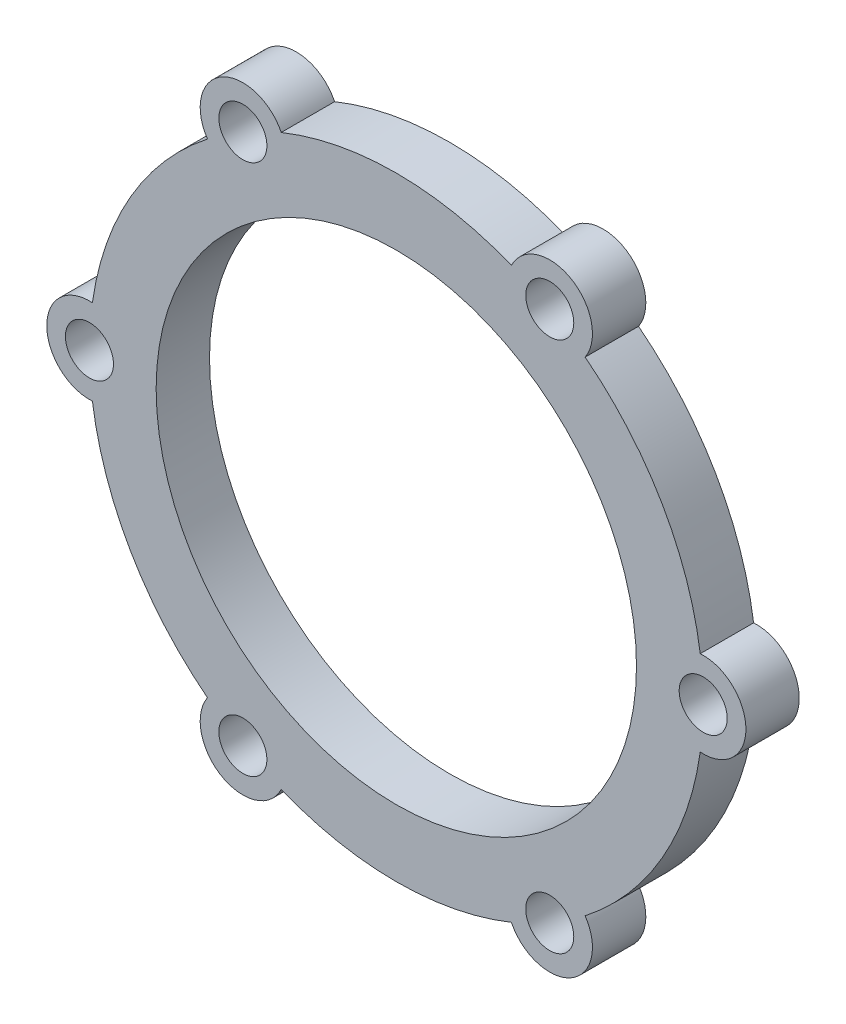
ISO-10303-21;
HEADER;
FILE_DESCRIPTION(('STEP AP214'),'2;1');
FILE_NAME('part.step','',(''),(''),'','','');
FILE_SCHEMA(('AUTOMOTIVE_DESIGN { 1 0 10303 214 1 1 1 1 }'));
ENDSEC;
DATA;
#1=APPLICATION_CONTEXT('core data for automotive mechanical design processes');
#2=APPLICATION_PROTOCOL_DEFINITION('international standard','automotive_design',2000,#1);
#3=PRODUCT_CONTEXT('',#1,'mechanical');
#4=PRODUCT('Part','Part','',(#3));
#5=PRODUCT_RELATED_PRODUCT_CATEGORY('part','',(#4));
#6=PRODUCT_DEFINITION_FORMATION('','',#4);
#7=PRODUCT_DEFINITION_CONTEXT('part definition',#1,'design');
#8=PRODUCT_DEFINITION('design','',#6,#7);
#9=PRODUCT_DEFINITION_SHAPE('','',#8);
#10=(LENGTH_UNIT() NAMED_UNIT(*) SI_UNIT(.MILLI.,.METRE.));
#11=(NAMED_UNIT(*) PLANE_ANGLE_UNIT() SI_UNIT($,.RADIAN.));
#12=(NAMED_UNIT(*) SI_UNIT($,.STERADIAN.) SOLID_ANGLE_UNIT());
#13=UNCERTAINTY_MEASURE_WITH_UNIT(LENGTH_MEASURE(1.E-05),#10,'distance_accuracy_value','');
#14=(GEOMETRIC_REPRESENTATION_CONTEXT(3) GLOBAL_UNCERTAINTY_ASSIGNED_CONTEXT((#13)) GLOBAL_UNIT_ASSIGNED_CONTEXT((#10,
#11,#12)) REPRESENTATION_CONTEXT('',''));
#15=CARTESIAN_POINT('',(0.,0.,0.));
#16=DIRECTION('',(0.,0.,1.));
#17=DIRECTION('',(1.,0.,0.));
#18=AXIS2_PLACEMENT_3D('',#15,#16,#17);
#19=CARTESIAN_POINT('',(-28.7499999999996,49.7964607176055,10.));
#20=DIRECTION('',(0.,0.,-1.));
#21=DIRECTION('',(-1.,0.,0.));
#22=AXIS2_PLACEMENT_3D('',#19,#20,#21);
#23=CYLINDRICAL_SURFACE('',#22,8.);
#24=CARTESIAN_POINT('',(-28.7499999999996,49.7964607176055,0.));
#25=DIRECTION('',(0.,0.,1.));
#26=DIRECTION('',(1.,0.,0.));
#27=AXIS2_PLACEMENT_3D('',#24,#25,#26);
#28=CIRCLE('',#27,8.);
#29=CARTESIAN_POINT('',(-21.5603201252367,53.3048083768933,0.));
#30=VERTEX_POINT('',#29);
#31=CARTESIAN_POINT('',(-35.383158135632,45.3241891306272,0.));
#32=VERTEX_POINT('',#31);
#33=EDGE_CURVE('E186',#30,#32,#28,.T.);
#34=ORIENTED_EDGE('',*,*,#33,.T.);
#35=DIRECTION('',(0.,0.,-1.));
#36=VECTOR('',#35,1.);
#37=CARTESIAN_POINT('',(-35.383158135632,45.3241891306272,10.));
#38=LINE('',#37,#36);
#39=CARTESIAN_POINT('',(-35.383158135632,45.3241891306272,10.));
#40=VERTEX_POINT('',#39);
#41=EDGE_CURVE('E11',#40,#32,#38,.T.);
#42=ORIENTED_EDGE('',*,*,#41,.F.);
#43=CARTESIAN_POINT('',(-28.7499999999996,49.7964607176055,10.));
#44=DIRECTION('',(0.,0.,1.));
#45=DIRECTION('',(1.,0.,0.));
#46=AXIS2_PLACEMENT_3D('',#43,#44,#45);
#47=CIRCLE('',#46,8.);
#48=CARTESIAN_POINT('',(-21.5603201252367,53.3048083768933,10.));
#49=VERTEX_POINT('',#48);
#50=EDGE_CURVE('E222',#49,#40,#47,.T.);
#51=ORIENTED_EDGE('',*,*,#50,.F.);
#52=DIRECTION('',(0.,0.,-1.));
#53=VECTOR('',#52,1.);
#54=CARTESIAN_POINT('',(-21.5603201252367,53.3048083768933,10.));
#55=LINE('',#54,#53);
#56=EDGE_CURVE('E184',#49,#30,#55,.T.);
#57=ORIENTED_EDGE('',*,*,#56,.T.);
#58=EDGE_LOOP('',(#34,#42,#51,#57));
#59=FACE_BOUND('',#58,.T.);
#60=ADVANCED_FACE('F43',(#59),#23,.T.);
#61=CARTESIAN_POINT('',(0.,0.,10.));
#62=DIRECTION('',(0.,0.,-1.));
#63=DIRECTION('',(-1.,0.,0.));
#64=AXIS2_PLACEMENT_3D('',#61,#62,#63);
#65=CYLINDRICAL_SURFACE('',#64,57.5);
#66=CARTESIAN_POINT('',(0.,0.,0.));
#67=DIRECTION('',(0.,0.,1.));
#68=DIRECTION('',(1.,0.,0.));
#69=AXIS2_PLACEMENT_3D('',#66,#67,#68);
#70=CIRCLE('',#69,57.5);
#71=CARTESIAN_POINT('',(-56.9434782608695,7.98061924626663,0.));
#72=VERTEX_POINT('',#71);
#73=EDGE_CURVE('E188',#32,#72,#70,.T.);
#74=ORIENTED_EDGE('',*,*,#73,.T.);
#75=DIRECTION('',(0.,0.,-1.));
#76=VECTOR('',#75,1.);
#77=CARTESIAN_POINT('',(-56.9434782608695,7.98061924626663,10.));
#78=LINE('',#77,#76);
#79=CARTESIAN_POINT('',(-56.9434782608695,7.98061924626663,10.));
#80=VERTEX_POINT('',#79);
#81=EDGE_CURVE('E51',#80,#72,#78,.T.);
#82=ORIENTED_EDGE('',*,*,#81,.F.);
#83=CARTESIAN_POINT('',(0.,0.,10.));
#84=DIRECTION('',(0.,0.,1.));
#85=DIRECTION('',(1.,0.,0.));
#86=AXIS2_PLACEMENT_3D('',#83,#84,#85);
#87=CIRCLE('',#86,57.5);
#88=EDGE_CURVE('E114',#40,#80,#87,.T.);
#89=ORIENTED_EDGE('',*,*,#88,.F.);
#90=ORIENTED_EDGE('',*,*,#41,.T.);
#91=EDGE_LOOP('',(#74,#82,#89,#90));
#92=FACE_BOUND('',#91,.T.);
#93=ADVANCED_FACE('F282',(#92),#65,.T.);
#94=CARTESIAN_POINT('',(-57.5,3.92047505570758E-13,10.));
#95=DIRECTION('',(0.,0.,-1.));
#96=DIRECTION('',(-1.,0.,0.));
#97=AXIS2_PLACEMENT_3D('',#94,#95,#96);
#98=CYLINDRICAL_SURFACE('',#97,8.);
#99=CARTESIAN_POINT('',(-57.5,3.92047505570758E-13,0.));
#100=DIRECTION('',(0.,0.,1.));
#101=DIRECTION('',(1.,0.,0.));
#102=AXIS2_PLACEMENT_3D('',#99,#100,#101);
#103=CIRCLE('',#102,8.);
#104=CARTESIAN_POINT('',(-56.9434782608696,-7.98061924626585,0.));
#105=VERTEX_POINT('',#104);
#106=EDGE_CURVE('E192',#72,#105,#103,.T.);
#107=ORIENTED_EDGE('',*,*,#106,.T.);
#108=DIRECTION('',(0.,0.,-1.));
#109=VECTOR('',#108,1.);
#110=CARTESIAN_POINT('',(-56.9434782608696,-7.98061924626585,10.));
#111=LINE('',#110,#109);
#112=CARTESIAN_POINT('',(-56.9434782608696,-7.98061924626585,10.));
#113=VERTEX_POINT('',#112);
#114=EDGE_CURVE('E243',#113,#105,#111,.T.);
#115=ORIENTED_EDGE('',*,*,#114,.F.);
#116=CARTESIAN_POINT('',(-57.5,3.92047505570758E-13,10.));
#117=DIRECTION('',(0.,0.,1.));
#118=DIRECTION('',(1.,0.,0.));
#119=AXIS2_PLACEMENT_3D('',#116,#117,#118);
#120=CIRCLE('',#119,8.);
#121=EDGE_CURVE('E252',#80,#113,#120,.T.);
#122=ORIENTED_EDGE('',*,*,#121,.F.);
#123=ORIENTED_EDGE('',*,*,#81,.T.);
#124=EDGE_LOOP('',(#107,#115,#122,#123));
#125=FACE_BOUND('',#124,.T.);
#126=ADVANCED_FACE('F249',(#125),#98,.T.);
#127=CARTESIAN_POINT('',(-35.3831581356326,-45.3241891306267,0.));
#128=VERTEX_POINT('',#127);
#129=EDGE_CURVE('E195',#105,#128,#70,.T.);
#130=ORIENTED_EDGE('',*,*,#129,.T.);
#131=DIRECTION('',(0.,0.,-1.));
#132=VECTOR('',#131,1.);
#133=CARTESIAN_POINT('',(-35.3831581356326,-45.3241891306267,10.));
#134=LINE('',#133,#132);
#135=CARTESIAN_POINT('',(-35.3831581356326,-45.3241891306267,10.));
#136=VERTEX_POINT('',#135);
#137=EDGE_CURVE('E238',#136,#128,#134,.T.);
#138=ORIENTED_EDGE('',*,*,#137,.F.);
#139=EDGE_CURVE('E570',#113,#136,#87,.T.);
#140=ORIENTED_EDGE('',*,*,#139,.F.);
#141=ORIENTED_EDGE('',*,*,#114,.T.);
#142=EDGE_LOOP('',(#130,#138,#140,#141));
#143=FACE_BOUND('',#142,.T.);
#144=ADVANCED_FACE('F291',(#143),#65,.T.);
#145=CARTESIAN_POINT('',(-28.7500000000002,-49.7964607176051,10.));
#146=DIRECTION('',(0.,0.,-1.));
#147=DIRECTION('',(-1.,0.,0.));
#148=AXIS2_PLACEMENT_3D('',#145,#146,#147);
#149=CYLINDRICAL_SURFACE('',#148,7.99999999999999);
#150=CARTESIAN_POINT('',(-28.7500000000002,-49.7964607176051,0.));
#151=DIRECTION('',(0.,0.,1.));
#152=DIRECTION('',(1.,0.,0.));
#153=AXIS2_PLACEMENT_3D('',#150,#151,#152);
#154=CIRCLE('',#153,7.99999999999999);
#155=CARTESIAN_POINT('',(-21.5603201252374,-53.304808376893,0.));
#156=VERTEX_POINT('',#155);
#157=EDGE_CURVE('E191',#128,#156,#154,.T.);
#158=ORIENTED_EDGE('',*,*,#157,.T.);
#159=DIRECTION('',(0.,0.,-1.));
#160=VECTOR('',#159,1.);
#161=CARTESIAN_POINT('',(-21.5603201252374,-53.304808376893,10.));
#162=LINE('',#161,#160);
#163=CARTESIAN_POINT('',(-21.5603201252374,-53.304808376893,10.));
#164=VERTEX_POINT('',#163);
#165=EDGE_CURVE('E240',#164,#156,#162,.T.);
#166=ORIENTED_EDGE('',*,*,#165,.F.);
#167=CARTESIAN_POINT('',(-28.7500000000002,-49.7964607176051,10.));
#168=DIRECTION('',(0.,0.,1.));
#169=DIRECTION('',(1.,0.,0.));
#170=AXIS2_PLACEMENT_3D('',#167,#168,#169);
#171=CIRCLE('',#170,7.99999999999999);
#172=EDGE_CURVE('E567',#136,#164,#171,.T.);
#173=ORIENTED_EDGE('',*,*,#172,.F.);
#174=ORIENTED_EDGE('',*,*,#137,.T.);
#175=EDGE_LOOP('',(#158,#166,#173,#174));
#176=FACE_BOUND('',#175,.T.);
#177=ADVANCED_FACE('F316',(#176),#149,.T.);
#178=CARTESIAN_POINT('',(21.5603201252371,-53.3048083768931,0.));
#179=VERTEX_POINT('',#178);
#180=EDGE_CURVE('E197',#156,#179,#70,.T.);
#181=ORIENTED_EDGE('',*,*,#180,.T.);
#182=DIRECTION('',(0.,0.,-1.));
#183=VECTOR('',#182,1.);
#184=CARTESIAN_POINT('',(21.5603201252371,-53.3048083768931,10.));
#185=LINE('',#184,#183);
#186=CARTESIAN_POINT('',(21.5603201252371,-53.3048083768931,10.));
#187=VERTEX_POINT('',#186);
#188=EDGE_CURVE('E233',#187,#179,#185,.T.);
#189=ORIENTED_EDGE('',*,*,#188,.F.);
#190=EDGE_CURVE('E564',#164,#187,#87,.T.);
#191=ORIENTED_EDGE('',*,*,#190,.F.);
#192=ORIENTED_EDGE('',*,*,#165,.T.);
#193=EDGE_LOOP('',(#181,#189,#191,#192));
#194=FACE_BOUND('',#193,.T.);
#195=ADVANCED_FACE('F320',(#194),#65,.T.);
#196=CARTESIAN_POINT('',(28.7499999999999,-49.7964607176053,10.));
#197=DIRECTION('',(0.,0.,-1.));
#198=DIRECTION('',(-1.,0.,0.));
#199=AXIS2_PLACEMENT_3D('',#196,#197,#198);
#200=CYLINDRICAL_SURFACE('',#199,8.);
#201=CARTESIAN_POINT('',(28.7499999999999,-49.7964607176053,0.));
#202=DIRECTION('',(0.,0.,1.));
#203=DIRECTION('',(1.,0.,0.));
#204=AXIS2_PLACEMENT_3D('',#201,#202,#203);
#205=CIRCLE('',#204,8.);
#206=CARTESIAN_POINT('',(35.3831581356323,-45.3241891306269,0.));
#207=VERTEX_POINT('',#206);
#208=EDGE_CURVE('E200',#179,#207,#205,.T.);
#209=ORIENTED_EDGE('',*,*,#208,.T.);
#210=DIRECTION('',(0.,0.,-1.));
#211=VECTOR('',#210,1.);
#212=CARTESIAN_POINT('',(35.3831581356323,-45.3241891306269,10.));
#213=LINE('',#212,#211);
#214=CARTESIAN_POINT('',(35.3831581356323,-45.3241891306269,10.));
#215=VERTEX_POINT('',#214);
#216=EDGE_CURVE('E231',#215,#207,#213,.T.);
#217=ORIENTED_EDGE('',*,*,#216,.F.);
#218=CARTESIAN_POINT('',(28.7499999999999,-49.7964607176053,10.));
#219=DIRECTION('',(0.,0.,1.));
#220=DIRECTION('',(1.,0.,0.));
#221=AXIS2_PLACEMENT_3D('',#218,#219,#220);
#222=CIRCLE('',#221,8.);
#223=EDGE_CURVE('E565',#187,#215,#222,.T.);
#224=ORIENTED_EDGE('',*,*,#223,.F.);
#225=ORIENTED_EDGE('',*,*,#188,.T.);
#226=EDGE_LOOP('',(#209,#217,#224,#225));
#227=FACE_BOUND('',#226,.T.);
#228=ADVANCED_FACE('F335',(#227),#200,.T.);
#229=CARTESIAN_POINT('',(56.9434782608696,-7.98061924626622,0.));
#230=VERTEX_POINT('',#229);
#231=EDGE_CURVE('E199',#207,#230,#70,.T.);
#232=ORIENTED_EDGE('',*,*,#231,.T.);
#233=DIRECTION('',(0.,0.,-1.));
#234=VECTOR('',#233,1.);
#235=CARTESIAN_POINT('',(56.9434782608696,-7.98061924626622,10.));
#236=LINE('',#235,#234);
#237=CARTESIAN_POINT('',(56.9434782608696,-7.98061924626622,10.));
#238=VERTEX_POINT('',#237);
#239=EDGE_CURVE('E228',#238,#230,#236,.T.);
#240=ORIENTED_EDGE('',*,*,#239,.F.);
#241=EDGE_CURVE('E152',#215,#238,#87,.T.);
#242=ORIENTED_EDGE('',*,*,#241,.F.);
#243=ORIENTED_EDGE('',*,*,#216,.T.);
#244=EDGE_LOOP('',(#232,#240,#242,#243));
#245=FACE_BOUND('',#244,.T.);
#246=ADVANCED_FACE('F266',(#245),#65,.T.);
#247=CARTESIAN_POINT('',(57.5,0.,10.));
#248=DIRECTION('',(0.,0.,-1.));
#249=DIRECTION('',(-1.,0.,0.));
#250=AXIS2_PLACEMENT_3D('',#247,#248,#249);
#251=CYLINDRICAL_SURFACE('',#250,8.);
#252=CARTESIAN_POINT('',(57.5,0.,0.));
#253=DIRECTION('',(0.,0.,1.));
#254=DIRECTION('',(1.,0.,0.));
#255=AXIS2_PLACEMENT_3D('',#252,#253,#254);
#256=CIRCLE('',#255,8.);
#257=CARTESIAN_POINT('',(56.9434782608696,7.98061924626627,0.));
#258=VERTEX_POINT('',#257);
#259=EDGE_CURVE('E196',#230,#258,#256,.T.);
#260=ORIENTED_EDGE('',*,*,#259,.T.);
#261=DIRECTION('',(0.,0.,-1.));
#262=VECTOR('',#261,1.);
#263=CARTESIAN_POINT('',(56.9434782608696,7.98061924626627,10.));
#264=LINE('',#263,#262);
#265=CARTESIAN_POINT('',(56.9434782608696,7.98061924626627,10.));
#266=VERTEX_POINT('',#265);
#267=EDGE_CURVE('E157',#266,#258,#264,.T.);
#268=ORIENTED_EDGE('',*,*,#267,.F.);
#269=CARTESIAN_POINT('',(57.5,0.,10.));
#270=DIRECTION('',(0.,0.,1.));
#271=DIRECTION('',(1.,0.,0.));
#272=AXIS2_PLACEMENT_3D('',#269,#270,#271);
#273=CIRCLE('',#272,8.);
#274=EDGE_CURVE('E147',#238,#266,#273,.T.);
#275=ORIENTED_EDGE('',*,*,#274,.F.);
#276=ORIENTED_EDGE('',*,*,#239,.T.);
#277=EDGE_LOOP('',(#260,#268,#275,#276));
#278=FACE_BOUND('',#277,.T.);
#279=ADVANCED_FACE('F275',(#278),#251,.T.);
#280=CARTESIAN_POINT('',(35.3831581356323,45.3241891306269,0.));
#281=VERTEX_POINT('',#280);
#282=EDGE_CURVE('E151',#258,#281,#70,.T.);
#283=ORIENTED_EDGE('',*,*,#282,.T.);
#284=DIRECTION('',(0.,0.,-1.));
#285=VECTOR('',#284,1.);
#286=CARTESIAN_POINT('',(35.3831581356323,45.3241891306269,10.));
#287=LINE('',#286,#285);
#288=CARTESIAN_POINT('',(35.3831581356323,45.3241891306269,10.));
#289=VERTEX_POINT('',#288);
#290=EDGE_CURVE('E155',#289,#281,#287,.T.);
#291=ORIENTED_EDGE('',*,*,#290,.F.);
#292=EDGE_CURVE('E137',#266,#289,#87,.T.);
#293=ORIENTED_EDGE('',*,*,#292,.F.);
#294=ORIENTED_EDGE('',*,*,#267,.T.);
#295=EDGE_LOOP('',(#283,#291,#293,#294));
#296=FACE_BOUND('',#295,.T.);
#297=ADVANCED_FACE('F153',(#296),#65,.T.);
#298=CARTESIAN_POINT('',(28.7499999999999,49.7964607176053,10.));
#299=DIRECTION('',(0.,0.,-1.));
#300=DIRECTION('',(-1.,0.,0.));
#301=AXIS2_PLACEMENT_3D('',#298,#299,#300);
#302=CYLINDRICAL_SURFACE('',#301,8.);
#303=CARTESIAN_POINT('',(28.7499999999999,49.7964607176053,0.));
#304=DIRECTION('',(0.,0.,1.));
#305=DIRECTION('',(1.,0.,0.));
#306=AXIS2_PLACEMENT_3D('',#303,#304,#305);
#307=CIRCLE('',#306,8.);
#308=CARTESIAN_POINT('',(21.5603201252371,53.3048083768931,0.));
#309=VERTEX_POINT('',#308);
#310=EDGE_CURVE('E99',#281,#309,#307,.T.);
#311=ORIENTED_EDGE('',*,*,#310,.T.);
#312=DIRECTION('',(0.,0.,-1.));
#313=VECTOR('',#312,1.);
#314=CARTESIAN_POINT('',(21.5603201252371,53.3048083768931,10.));
#315=LINE('',#314,#313);
#316=CARTESIAN_POINT('',(21.5603201252371,53.3048083768931,10.));
#317=VERTEX_POINT('',#316);
#318=EDGE_CURVE('E160',#317,#309,#315,.T.);
#319=ORIENTED_EDGE('',*,*,#318,.F.);
#320=CARTESIAN_POINT('',(28.7499999999999,49.7964607176053,10.));
#321=DIRECTION('',(0.,0.,1.));
#322=DIRECTION('',(1.,0.,0.));
#323=AXIS2_PLACEMENT_3D('',#320,#321,#322);
#324=CIRCLE('',#323,8.);
#325=EDGE_CURVE('E143',#289,#317,#324,.T.);
#326=ORIENTED_EDGE('',*,*,#325,.F.);
#327=ORIENTED_EDGE('',*,*,#290,.T.);
#328=EDGE_LOOP('',(#311,#319,#326,#327));
#329=FACE_BOUND('',#328,.T.);
#330=ADVANCED_FACE('F159',(#329),#302,.T.);
#331=CARTESIAN_POINT('',(28.7499999999999,49.7964607176053,10.));
#332=DIRECTION('',(0.,0.,-1.));
#333=DIRECTION('',(-1.,0.,0.));
#334=AXIS2_PLACEMENT_3D('',#331,#332,#333);
#335=CYLINDRICAL_SURFACE('',#334,4.5);
#336=CARTESIAN_POINT('',(28.7499999999999,49.7964607176053,10.));
#337=DIRECTION('',(0.,0.,1.));
#338=DIRECTION('',(1.,0.,0.));
#339=AXIS2_PLACEMENT_3D('',#336,#337,#338);
#340=CIRCLE('',#339,4.5);
#341=CARTESIAN_POINT('',(33.2499999999999,49.7964607176053,10.));
#342=VERTEX_POINT('',#341);
#343=EDGE_CURVE('E177',#342,#342,#340,.T.);
#344=ORIENTED_EDGE('',*,*,#343,.T.);
#345=EDGE_LOOP('',(#344));
#346=FACE_BOUND('',#345,.T.);
#347=CARTESIAN_POINT('',(28.7499999999999,49.7964607176053,0.));
#348=DIRECTION('',(0.,0.,1.));
#349=DIRECTION('',(1.,0.,0.));
#350=AXIS2_PLACEMENT_3D('',#347,#348,#349);
#351=CIRCLE('',#350,4.5);
#352=CARTESIAN_POINT('',(33.2499999999999,49.7964607176053,0.));
#353=VERTEX_POINT('',#352);
#354=EDGE_CURVE('E216',#353,#353,#351,.T.);
#355=ORIENTED_EDGE('',*,*,#354,.F.);
#356=EDGE_LOOP('',(#355));
#357=FACE_BOUND('',#356,.T.);
#358=ADVANCED_FACE('F364',(#346,#357),#335,.F.);
#359=CARTESIAN_POINT('',(57.5,0.,10.));
#360=DIRECTION('',(0.,0.,-1.));
#361=DIRECTION('',(-1.,0.,0.));
#362=AXIS2_PLACEMENT_3D('',#359,#360,#361);
#363=CYLINDRICAL_SURFACE('',#362,4.49999999999999);
#364=CARTESIAN_POINT('',(57.5,0.,10.));
#365=DIRECTION('',(0.,0.,1.));
#366=DIRECTION('',(1.,0.,0.));
#367=AXIS2_PLACEMENT_3D('',#364,#365,#366);
#368=CIRCLE('',#367,4.49999999999999);
#369=CARTESIAN_POINT('',(62.,0.,10.));
#370=VERTEX_POINT('',#369);
#371=EDGE_CURVE('E176',#370,#370,#368,.T.);
#372=ORIENTED_EDGE('',*,*,#371,.T.);
#373=EDGE_LOOP('',(#372));
#374=FACE_BOUND('',#373,.T.);
#375=CARTESIAN_POINT('',(57.5,0.,0.));
#376=DIRECTION('',(0.,0.,1.));
#377=DIRECTION('',(1.,0.,0.));
#378=AXIS2_PLACEMENT_3D('',#375,#376,#377);
#379=CIRCLE('',#378,4.49999999999999);
#380=CARTESIAN_POINT('',(62.,0.,0.));
#381=VERTEX_POINT('',#380);
#382=EDGE_CURVE('E214',#381,#381,#379,.T.);
#383=ORIENTED_EDGE('',*,*,#382,.F.);
#384=EDGE_LOOP('',(#383));
#385=FACE_BOUND('',#384,.T.);
#386=ADVANCED_FACE('F375',(#374,#385),#363,.F.);
#387=CARTESIAN_POINT('',(28.7499999999999,-49.7964607176053,10.));
#388=DIRECTION('',(0.,0.,-1.));
#389=DIRECTION('',(-1.,0.,0.));
#390=AXIS2_PLACEMENT_3D('',#387,#388,#389);
#391=CYLINDRICAL_SURFACE('',#390,4.5);
#392=CARTESIAN_POINT('',(28.7499999999999,-49.7964607176053,10.));
#393=DIRECTION('',(0.,0.,1.));
#394=DIRECTION('',(1.,0.,0.));
#395=AXIS2_PLACEMENT_3D('',#392,#393,#394);
#396=CIRCLE('',#395,4.5);
#397=CARTESIAN_POINT('',(33.2499999999999,-49.7964607176053,10.));
#398=VERTEX_POINT('',#397);
#399=EDGE_CURVE('E171',#398,#398,#396,.T.);
#400=ORIENTED_EDGE('',*,*,#399,.T.);
#401=EDGE_LOOP('',(#400));
#402=FACE_BOUND('',#401,.T.);
#403=CARTESIAN_POINT('',(28.7499999999999,-49.7964607176053,0.));
#404=DIRECTION('',(0.,0.,1.));
#405=DIRECTION('',(1.,0.,0.));
#406=AXIS2_PLACEMENT_3D('',#403,#404,#405);
#407=CIRCLE('',#406,4.5);
#408=CARTESIAN_POINT('',(33.2499999999999,-49.7964607176053,0.));
#409=VERTEX_POINT('',#408);
#410=EDGE_CURVE('E212',#409,#409,#407,.T.);
#411=ORIENTED_EDGE('',*,*,#410,.F.);
#412=EDGE_LOOP('',(#411));
#413=FACE_BOUND('',#412,.T.);
#414=ADVANCED_FACE('F382',(#402,#413),#391,.F.);
#415=CARTESIAN_POINT('',(-28.7500000000002,-49.7964607176051,10.));
#416=DIRECTION('',(0.,0.,-1.));
#417=DIRECTION('',(-1.,0.,0.));
#418=AXIS2_PLACEMENT_3D('',#415,#416,#417);
#419=CYLINDRICAL_SURFACE('',#418,4.5);
#420=CARTESIAN_POINT('',(-28.7500000000002,-49.7964607176051,10.));
#421=DIRECTION('',(0.,0.,1.));
#422=DIRECTION('',(1.,0.,0.));
#423=AXIS2_PLACEMENT_3D('',#420,#421,#422);
#424=CIRCLE('',#423,4.5);
#425=CARTESIAN_POINT('',(-24.2500000000002,-49.7964607176051,10.));
#426=VERTEX_POINT('',#425);
#427=EDGE_CURVE('E169',#426,#426,#424,.T.);
#428=ORIENTED_EDGE('',*,*,#427,.T.);
#429=EDGE_LOOP('',(#428));
#430=FACE_BOUND('',#429,.T.);
#431=CARTESIAN_POINT('',(-28.7500000000002,-49.7964607176051,0.));
#432=DIRECTION('',(0.,0.,1.));
#433=DIRECTION('',(1.,0.,0.));
#434=AXIS2_PLACEMENT_3D('',#431,#432,#433);
#435=CIRCLE('',#434,4.5);
#436=CARTESIAN_POINT('',(-24.2500000000002,-49.7964607176051,0.));
#437=VERTEX_POINT('',#436);
#438=EDGE_CURVE('E209',#437,#437,#435,.T.);
#439=ORIENTED_EDGE('',*,*,#438,.F.);
#440=EDGE_LOOP('',(#439));
#441=FACE_BOUND('',#440,.T.);
#442=ADVANCED_FACE('F386',(#430,#441),#419,.F.);
#443=CARTESIAN_POINT('',(-57.5,3.92047505570758E-13,10.));
#444=DIRECTION('',(0.,0.,-1.));
#445=DIRECTION('',(-1.,0.,0.));
#446=AXIS2_PLACEMENT_3D('',#443,#444,#445);
#447=CYLINDRICAL_SURFACE('',#446,4.49999999999999);
#448=CARTESIAN_POINT('',(-57.5,3.92047505570758E-13,10.));
#449=DIRECTION('',(0.,0.,1.));
#450=DIRECTION('',(1.,0.,0.));
#451=AXIS2_PLACEMENT_3D('',#448,#449,#450);
#452=CIRCLE('',#451,4.49999999999999);
#453=CARTESIAN_POINT('',(-53.,3.92047505570758E-13,10.));
#454=VERTEX_POINT('',#453);
#455=EDGE_CURVE('E167',#454,#454,#452,.T.);
#456=ORIENTED_EDGE('',*,*,#455,.T.);
#457=EDGE_LOOP('',(#456));
#458=FACE_BOUND('',#457,.T.);
#459=CARTESIAN_POINT('',(-57.5,3.92047505570758E-13,0.));
#460=DIRECTION('',(0.,0.,1.));
#461=DIRECTION('',(1.,0.,0.));
#462=AXIS2_PLACEMENT_3D('',#459,#460,#461);
#463=CIRCLE('',#462,4.49999999999999);
#464=CARTESIAN_POINT('',(-53.,3.92047505570758E-13,0.));
#465=VERTEX_POINT('',#464);
#466=EDGE_CURVE('E207',#465,#465,#463,.T.);
#467=ORIENTED_EDGE('',*,*,#466,.F.);
#468=EDGE_LOOP('',(#467));
#469=FACE_BOUND('',#468,.T.);
#470=ADVANCED_FACE('F288',(#458,#469),#447,.F.);
#471=CARTESIAN_POINT('',(-28.7499999999996,49.7964607176055,10.));
#472=DIRECTION('',(0.,0.,-1.));
#473=DIRECTION('',(-1.,0.,0.));
#474=AXIS2_PLACEMENT_3D('',#471,#472,#473);
#475=CYLINDRICAL_SURFACE('',#474,4.5);
#476=CARTESIAN_POINT('',(-28.7499999999996,49.7964607176055,10.));
#477=DIRECTION('',(0.,0.,1.));
#478=DIRECTION('',(1.,0.,0.));
#479=AXIS2_PLACEMENT_3D('',#476,#477,#478);
#480=CIRCLE('',#479,4.5);
#481=CARTESIAN_POINT('',(-24.2499999999996,49.7964607176055,10.));
#482=VERTEX_POINT('',#481);
#483=EDGE_CURVE('E162',#482,#482,#480,.T.);
#484=ORIENTED_EDGE('',*,*,#483,.T.);
#485=EDGE_LOOP('',(#484));
#486=FACE_BOUND('',#485,.T.);
#487=CARTESIAN_POINT('',(-28.7499999999996,49.7964607176055,0.));
#488=DIRECTION('',(0.,0.,1.));
#489=DIRECTION('',(1.,0.,0.));
#490=AXIS2_PLACEMENT_3D('',#487,#488,#489);
#491=CIRCLE('',#490,4.5);
#492=CARTESIAN_POINT('',(-24.2499999999996,49.7964607176055,0.));
#493=VERTEX_POINT('',#492);
#494=EDGE_CURVE('E201',#493,#493,#491,.T.);
#495=ORIENTED_EDGE('',*,*,#494,.F.);
#496=EDGE_LOOP('',(#495));
#497=FACE_BOUND('',#496,.T.);
#498=ADVANCED_FACE('F278',(#486,#497),#475,.F.);
#499=EDGE_CURVE('E107',#309,#30,#70,.T.);
#500=ORIENTED_EDGE('',*,*,#499,.T.);
#501=ORIENTED_EDGE('',*,*,#56,.F.);
#502=EDGE_CURVE('E56',#317,#49,#87,.T.);
#503=ORIENTED_EDGE('',*,*,#502,.F.);
#504=ORIENTED_EDGE('',*,*,#318,.T.);
#505=EDGE_LOOP('',(#500,#501,#503,#504));
#506=FACE_BOUND('',#505,.T.);
#507=ADVANCED_FACE('F276',(#506),#65,.T.);
#508=CARTESIAN_POINT('',(0.,0.,10.));
#509=DIRECTION('',(0.,0.,-1.));
#510=DIRECTION('',(-1.,0.,0.));
#511=AXIS2_PLACEMENT_3D('',#508,#509,#510);
#512=CYLINDRICAL_SURFACE('',#511,45.);
#513=CARTESIAN_POINT('',(0.,0.,10.));
#514=DIRECTION('',(0.,0.,1.));
#515=DIRECTION('',(1.,0.,0.));
#516=AXIS2_PLACEMENT_3D('',#513,#514,#515);
#517=CIRCLE('',#516,45.);
#518=CARTESIAN_POINT('',(45.,0.,10.));
#519=VERTEX_POINT('',#518);
#520=EDGE_CURVE('E185',#519,#519,#517,.T.);
#521=ORIENTED_EDGE('',*,*,#520,.T.);
#522=EDGE_LOOP('',(#521));
#523=FACE_BOUND('',#522,.T.);
#524=CARTESIAN_POINT('',(0.,0.,0.));
#525=DIRECTION('',(0.,0.,1.));
#526=DIRECTION('',(1.,0.,0.));
#527=AXIS2_PLACEMENT_3D('',#524,#525,#526);
#528=CIRCLE('',#527,45.);
#529=CARTESIAN_POINT('',(45.,0.,0.));
#530=VERTEX_POINT('',#529);
#531=EDGE_CURVE('E221',#530,#530,#528,.T.);
#532=ORIENTED_EDGE('',*,*,#531,.F.);
#533=EDGE_LOOP('',(#532));
#534=FACE_BOUND('',#533,.T.);
#535=ADVANCED_FACE('F277',(#523,#534),#512,.F.);
#536=CARTESIAN_POINT('',(0.,0.,10.));
#537=DIRECTION('',(0.,0.,1.));
#538=DIRECTION('',(1.,0.,0.));
#539=AXIS2_PLACEMENT_3D('',#536,#537,#538);
#540=PLANE('',#539);
#541=ORIENTED_EDGE('',*,*,#50,.T.);
#542=ORIENTED_EDGE('',*,*,#88,.T.);
#543=ORIENTED_EDGE('',*,*,#121,.T.);
#544=ORIENTED_EDGE('',*,*,#139,.T.);
#545=ORIENTED_EDGE('',*,*,#172,.T.);
#546=ORIENTED_EDGE('',*,*,#190,.T.);
#547=ORIENTED_EDGE('',*,*,#223,.T.);
#548=ORIENTED_EDGE('',*,*,#241,.T.);
#549=ORIENTED_EDGE('',*,*,#274,.T.);
#550=ORIENTED_EDGE('',*,*,#292,.T.);
#551=ORIENTED_EDGE('',*,*,#325,.T.);
#552=ORIENTED_EDGE('',*,*,#502,.T.);
#553=EDGE_LOOP('',(#541,#542,#543,#544,#545,#546,#547,#548,#549,#550,#551,#552));
#554=FACE_BOUND('',#553,.T.);
#555=ORIENTED_EDGE('',*,*,#483,.F.);
#556=EDGE_LOOP('',(#555));
#557=FACE_BOUND('',#556,.T.);
#558=ORIENTED_EDGE('',*,*,#455,.F.);
#559=EDGE_LOOP('',(#558));
#560=FACE_BOUND('',#559,.T.);
#561=ORIENTED_EDGE('',*,*,#427,.F.);
#562=EDGE_LOOP('',(#561));
#563=FACE_BOUND('',#562,.T.);
#564=ORIENTED_EDGE('',*,*,#399,.F.);
#565=EDGE_LOOP('',(#564));
#566=FACE_BOUND('',#565,.T.);
#567=ORIENTED_EDGE('',*,*,#371,.F.);
#568=EDGE_LOOP('',(#567));
#569=FACE_BOUND('',#568,.T.);
#570=ORIENTED_EDGE('',*,*,#343,.F.);
#571=EDGE_LOOP('',(#570));
#572=FACE_BOUND('',#571,.T.);
#573=ORIENTED_EDGE('',*,*,#520,.F.);
#574=EDGE_LOOP('',(#573));
#575=FACE_BOUND('',#574,.T.);
#576=ADVANCED_FACE('F141',(#554,#557,#560,#563,#566,#569,#572,#575),#540,.T.);
#577=CARTESIAN_POINT('',(0.,0.,0.));
#578=DIRECTION('',(0.,0.,1.));
#579=DIRECTION('',(1.,0.,0.));
#580=AXIS2_PLACEMENT_3D('',#577,#578,#579);
#581=PLANE('',#580);
#582=ORIENTED_EDGE('',*,*,#33,.F.);
#583=ORIENTED_EDGE('',*,*,#499,.F.);
#584=ORIENTED_EDGE('',*,*,#310,.F.);
#585=ORIENTED_EDGE('',*,*,#282,.F.);
#586=ORIENTED_EDGE('',*,*,#259,.F.);
#587=ORIENTED_EDGE('',*,*,#231,.F.);
#588=ORIENTED_EDGE('',*,*,#208,.F.);
#589=ORIENTED_EDGE('',*,*,#180,.F.);
#590=ORIENTED_EDGE('',*,*,#157,.F.);
#591=ORIENTED_EDGE('',*,*,#129,.F.);
#592=ORIENTED_EDGE('',*,*,#106,.F.);
#593=ORIENTED_EDGE('',*,*,#73,.F.);
#594=EDGE_LOOP('',(#582,#583,#584,#585,#586,#587,#588,#589,#590,#591,#592,#593));
#595=FACE_BOUND('',#594,.T.);
#596=ORIENTED_EDGE('',*,*,#494,.T.);
#597=EDGE_LOOP('',(#596));
#598=FACE_BOUND('',#597,.T.);
#599=ORIENTED_EDGE('',*,*,#466,.T.);
#600=EDGE_LOOP('',(#599));
#601=FACE_BOUND('',#600,.T.);
#602=ORIENTED_EDGE('',*,*,#438,.T.);
#603=EDGE_LOOP('',(#602));
#604=FACE_BOUND('',#603,.T.);
#605=ORIENTED_EDGE('',*,*,#410,.T.);
#606=EDGE_LOOP('',(#605));
#607=FACE_BOUND('',#606,.T.);
#608=ORIENTED_EDGE('',*,*,#382,.T.);
#609=EDGE_LOOP('',(#608));
#610=FACE_BOUND('',#609,.T.);
#611=ORIENTED_EDGE('',*,*,#354,.T.);
#612=EDGE_LOOP('',(#611));
#613=FACE_BOUND('',#612,.T.);
#614=ORIENTED_EDGE('',*,*,#531,.T.);
#615=EDGE_LOOP('',(#614));
#616=FACE_BOUND('',#615,.T.);
#617=ADVANCED_FACE('F251',(#595,#598,#601,#604,#607,#610,#613,#616),#581,.F.);
#618=CLOSED_SHELL('',(#60,#93,#126,#144,#177,#195,#228,#246,#279,#297,#330,#358,#386,#414,#442,
#470,#498,#507,#535,#576,#617));
#619=MANIFOLD_SOLID_BREP('B2',#618);
#620=ADVANCED_BREP_SHAPE_REPRESENTATION('',(#18,#619),#14);
#621=SHAPE_DEFINITION_REPRESENTATION(#9,#620);
ENDSEC;
END-ISO-10303-21;
